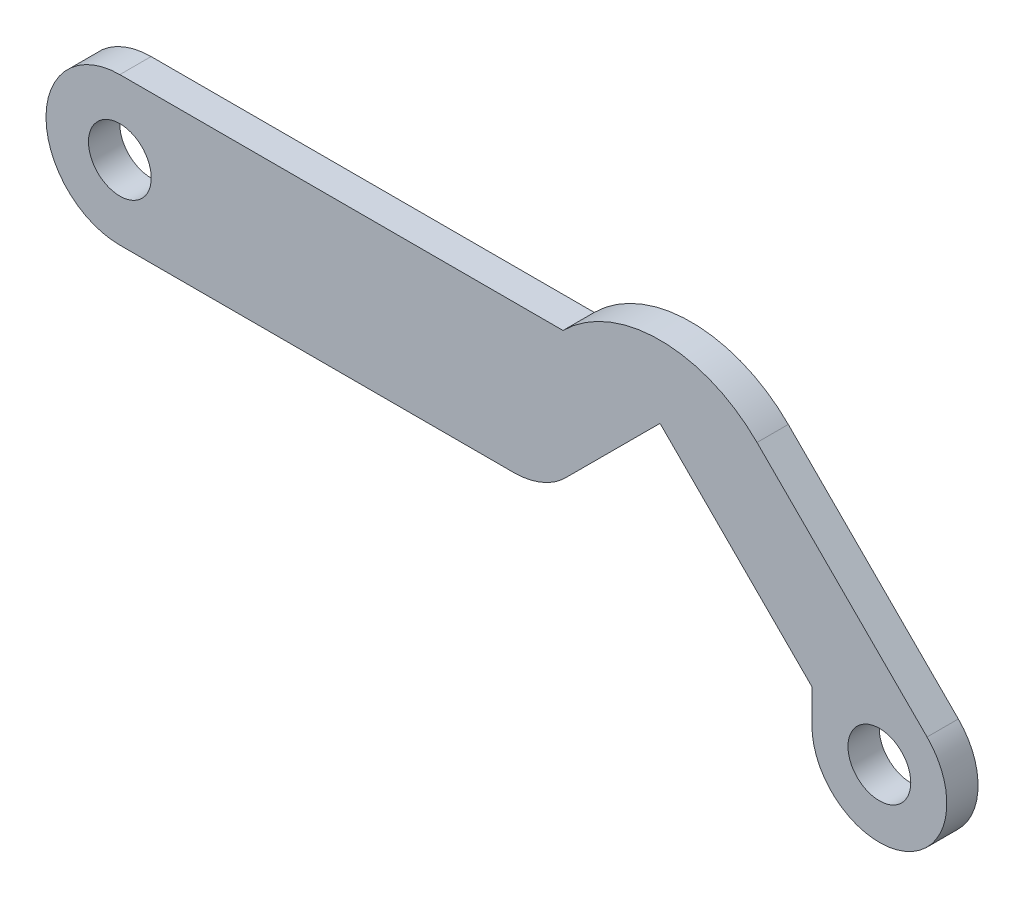
ISO-10303-21;
HEADER;
FILE_DESCRIPTION(('STEP AP214'),'2;1');
FILE_NAME('part.step','',(''),(''),'','','');
FILE_SCHEMA(('AUTOMOTIVE_DESIGN { 1 0 10303 214 1 1 1 1 }'));
ENDSEC;
DATA;
#1=APPLICATION_CONTEXT('core data for automotive mechanical design processes');
#2=APPLICATION_PROTOCOL_DEFINITION('international standard','automotive_design',2000,#1);
#3=PRODUCT_CONTEXT('',#1,'mechanical');
#4=PRODUCT('Part','Part','',(#3));
#5=PRODUCT_RELATED_PRODUCT_CATEGORY('part','',(#4));
#6=PRODUCT_DEFINITION_FORMATION('','',#4);
#7=PRODUCT_DEFINITION_CONTEXT('part definition',#1,'design');
#8=PRODUCT_DEFINITION('design','',#6,#7);
#9=PRODUCT_DEFINITION_SHAPE('','',#8);
#10=(LENGTH_UNIT() NAMED_UNIT(*) SI_UNIT(.MILLI.,.METRE.));
#11=(NAMED_UNIT(*) PLANE_ANGLE_UNIT() SI_UNIT($,.RADIAN.));
#12=(NAMED_UNIT(*) SI_UNIT($,.STERADIAN.) SOLID_ANGLE_UNIT());
#13=UNCERTAINTY_MEASURE_WITH_UNIT(LENGTH_MEASURE(1.E-05),#10,'distance_accuracy_value','');
#14=(GEOMETRIC_REPRESENTATION_CONTEXT(3) GLOBAL_UNCERTAINTY_ASSIGNED_CONTEXT((#13)) GLOBAL_UNIT_ASSIGNED_CONTEXT((#10,
#11,#12)) REPRESENTATION_CONTEXT('',''));
#15=CARTESIAN_POINT('',(0.,0.,0.));
#16=DIRECTION('',(0.,0.,1.));
#17=DIRECTION('',(1.,0.,0.));
#18=AXIS2_PLACEMENT_3D('',#15,#16,#17);
#19=CARTESIAN_POINT('',(0.,0.,3.175));
#20=DIRECTION('',(0.,0.,1.));
#21=DIRECTION('',(1.,0.,0.));
#22=AXIS2_PLACEMENT_3D('',#19,#20,#21);
#23=PLANE('',#22);
#24=DIRECTION('',(0.707106781186546,-0.707106781186549,0.));
#25=VECTOR('',#24,1.);
#26=CARTESIAN_POINT('',(17.3544964901299,17.3544964901299,3.175));
#27=LINE('',#26,#25);
#28=CARTESIAN_POINT('',(27.2089929802598,7.5,3.175));
#29=VERTEX_POINT('',#28);
#30=CARTESIAN_POINT('',(44.4795253726149,-9.77053239235524,3.175));
#31=VERTEX_POINT('',#30);
#32=EDGE_CURVE('E282',#29,#31,#27,.T.);
#33=ORIENTED_EDGE('',*,*,#32,.F.);
#34=CARTESIAN_POINT('',(17.3584345872163,-2.35055839304351,3.175));
#35=DIRECTION('',(0.,0.,1.));
#36=DIRECTION('',(1.,0.,0.));
#37=AXIS2_PLACEMENT_3D('',#34,#35,#36);
#38=CIRCLE('',#37,13.9307932763902);
#39=CARTESIAN_POINT('',(7.5078761941729,7.5,3.175));
#40=VERTEX_POINT('',#39);
#41=EDGE_CURVE('E223',#40,#29,#38,.F.);
#42=ORIENTED_EDGE('',*,*,#41,.F.);
#43=DIRECTION('',(1.,0.,0.));
#44=VECTOR('',#43,1.);
#45=CARTESIAN_POINT('',(-20.71,7.5,3.175));
#46=LINE('',#45,#44);
#47=CARTESIAN_POINT('',(-37.5,7.5,3.175));
#48=VERTEX_POINT('',#47);
#49=EDGE_CURVE('E216',#48,#40,#46,.T.);
#50=ORIENTED_EDGE('',*,*,#49,.F.);
#51=CARTESIAN_POINT('',(-37.5,0.,3.175));
#52=DIRECTION('',(0.,0.,1.));
#53=DIRECTION('',(1.,0.,0.));
#54=AXIS2_PLACEMENT_3D('',#51,#52,#53);
#55=CIRCLE('',#54,7.5);
#56=CARTESIAN_POINT('',(-37.5,-7.5,3.175));
#57=VERTEX_POINT('',#56);
#58=EDGE_CURVE('E220',#57,#48,#55,.F.);
#59=ORIENTED_EDGE('',*,*,#58,.F.);
#60=DIRECTION('',(1.,0.,0.));
#61=VECTOR('',#60,1.);
#62=CARTESIAN_POINT('',(0.,-7.5,3.175));
#63=LINE('',#62,#61);
#64=CARTESIAN_POINT('',(2.5,-7.5,3.175));
#65=VERTEX_POINT('',#64);
#66=EDGE_CURVE('E12',#57,#65,#63,.T.);
#67=ORIENTED_EDGE('',*,*,#66,.T.);
#68=CARTESIAN_POINT('',(2.5,0.,3.175));
#69=DIRECTION('',(0.,0.,1.));
#70=DIRECTION('',(1.,0.,0.));
#71=AXIS2_PLACEMENT_3D('',#68,#69,#70);
#72=CIRCLE('',#71,7.5);
#73=CARTESIAN_POINT('',(8.03869510450984,-5.05696119614128,3.175));
#74=VERTEX_POINT('',#73);
#75=EDGE_CURVE('E302',#65,#74,#72,.T.);
#76=ORIENTED_EDGE('',*,*,#75,.T.);
#77=DIRECTION('',(0.707457856158301,0.706755531821223,0.));
#78=VECTOR('',#77,1.);
#79=CARTESIAN_POINT('',(6.54383474051305,-6.55033754691378,3.175));
#80=LINE('',#79,#78);
#81=CARTESIAN_POINT('',(17.3584345872163,4.25352617381113,3.175));
#82=VERTEX_POINT('',#81);
#83=EDGE_CURVE('E272',#74,#82,#80,.T.);
#84=ORIENTED_EDGE('',*,*,#83,.T.);
#85=DIRECTION('',(-0.706755531821223,0.707457856158301,0.));
#86=VECTOR('',#85,1.);
#87=CARTESIAN_POINT('',(32.7858439214871,-11.1892138434832,3.175));
#88=LINE('',#87,#86);
#89=CARTESIAN_POINT('',(32.7858439214871,-11.1892138434832,3.175));
#90=VERTEX_POINT('',#89);
#91=EDGE_CURVE('E162',#90,#82,#88,.T.);
#92=ORIENTED_EDGE('',*,*,#91,.F.);
#93=DIRECTION('',(0.,1.,0.));
#94=VECTOR('',#93,1.);
#95=CARTESIAN_POINT('',(32.7858439214871,-14.6142138434831,3.175));
#96=LINE('',#95,#94);
#97=CARTESIAN_POINT('',(32.7858439214871,-14.6142138434831,3.175));
#98=VERTEX_POINT('',#97);
#99=EDGE_CURVE('E284',#98,#90,#96,.T.);
#100=ORIENTED_EDGE('',*,*,#99,.F.);
#101=CARTESIAN_POINT('',(39.6358439214871,-14.6142138434831,3.175));
#102=DIRECTION('',(0.,0.,1.));
#103=DIRECTION('',(1.,0.,0.));
#104=AXIS2_PLACEMENT_3D('',#101,#102,#103);
#105=CIRCLE('',#104,6.85);
#106=EDGE_CURVE('E292',#31,#98,#105,.F.);
#107=ORIENTED_EDGE('',*,*,#106,.F.);
#108=EDGE_LOOP('',(#33,#42,#50,#59,#67,#76,#84,#92,#100,#107));
#109=FACE_BOUND('',#108,.T.);
#110=CARTESIAN_POINT('',(39.6358439214871,-14.6142138434831,3.175));
#111=DIRECTION('',(0.,0.,1.));
#112=DIRECTION('',(1.,0.,0.));
#113=AXIS2_PLACEMENT_3D('',#110,#111,#112);
#114=CIRCLE('',#113,3.1875);
#115=CARTESIAN_POINT('',(42.8233439214871,-14.6142138434831,3.175));
#116=VERTEX_POINT('',#115);
#117=EDGE_CURVE('E248',#116,#116,#114,.F.);
#118=ORIENTED_EDGE('',*,*,#117,.T.);
#119=EDGE_LOOP('',(#118));
#120=FACE_BOUND('',#119,.T.);
#121=CARTESIAN_POINT('',(-37.5,0.,3.175));
#122=DIRECTION('',(0.,0.,1.));
#123=DIRECTION('',(1.,0.,0.));
#124=AXIS2_PLACEMENT_3D('',#121,#122,#123);
#125=CIRCLE('',#124,3.1875);
#126=CARTESIAN_POINT('',(-34.3125,0.,3.175));
#127=VERTEX_POINT('',#126);
#128=EDGE_CURVE('E241',#127,#127,#125,.F.);
#129=ORIENTED_EDGE('',*,*,#128,.T.);
#130=EDGE_LOOP('',(#129));
#131=FACE_BOUND('',#130,.T.);
#132=ADVANCED_FACE('F139',(#109,#120,#131),#23,.T.);
#133=CARTESIAN_POINT('',(0.,0.,0.));
#134=DIRECTION('',(0.,0.,1.));
#135=DIRECTION('',(1.,0.,0.));
#136=AXIS2_PLACEMENT_3D('',#133,#134,#135);
#137=PLANE('',#136);
#138=DIRECTION('',(1.,0.,0.));
#139=VECTOR('',#138,1.);
#140=CARTESIAN_POINT('',(-20.71,7.5,0.));
#141=LINE('',#140,#139);
#142=CARTESIAN_POINT('',(-37.5,7.5,0.));
#143=VERTEX_POINT('',#142);
#144=CARTESIAN_POINT('',(7.50787619417291,7.5,0.));
#145=VERTEX_POINT('',#144);
#146=EDGE_CURVE('E226',#143,#145,#141,.T.);
#147=ORIENTED_EDGE('',*,*,#146,.T.);
#148=CARTESIAN_POINT('',(17.3584345872163,-2.35055839304351,0.));
#149=DIRECTION('',(0.,0.,-1.));
#150=DIRECTION('',(1.,0.,0.));
#151=AXIS2_PLACEMENT_3D('',#148,#149,#150);
#152=CIRCLE('',#151,13.9307932763902);
#153=CARTESIAN_POINT('',(27.2089929802598,7.5,0.));
#154=VERTEX_POINT('',#153);
#155=EDGE_CURVE('E251',#145,#154,#152,.T.);
#156=ORIENTED_EDGE('',*,*,#155,.T.);
#157=DIRECTION('',(-0.707106781186546,0.707106781186549,0.));
#158=VECTOR('',#157,1.);
#159=CARTESIAN_POINT('',(17.3544964901299,17.3544964901299,0.));
#160=LINE('',#159,#158);
#161=CARTESIAN_POINT('',(44.4795253726149,-9.77053239235524,0.));
#162=VERTEX_POINT('',#161);
#163=EDGE_CURVE('E275',#162,#154,#160,.T.);
#164=ORIENTED_EDGE('',*,*,#163,.F.);
#165=CARTESIAN_POINT('',(39.6358439214871,-14.6142138434831,0.));
#166=DIRECTION('',(0.,0.,-1.));
#167=DIRECTION('',(-1.,0.,0.));
#168=AXIS2_PLACEMENT_3D('',#165,#166,#167);
#169=CIRCLE('',#168,6.85);
#170=CARTESIAN_POINT('',(32.7858439214871,-14.6142138434831,0.));
#171=VERTEX_POINT('',#170);
#172=EDGE_CURVE('E293',#162,#171,#169,.T.);
#173=ORIENTED_EDGE('',*,*,#172,.T.);
#174=DIRECTION('',(0.,1.,0.));
#175=VECTOR('',#174,1.);
#176=CARTESIAN_POINT('',(32.7858439214871,-14.6142138434831,0.));
#177=LINE('',#176,#175);
#178=CARTESIAN_POINT('',(32.7858439214871,-11.1892138434832,0.));
#179=VERTEX_POINT('',#178);
#180=EDGE_CURVE('E287',#171,#179,#177,.T.);
#181=ORIENTED_EDGE('',*,*,#180,.T.);
#182=DIRECTION('',(-0.706755531821223,0.707457856158301,0.));
#183=VECTOR('',#182,1.);
#184=CARTESIAN_POINT('',(32.7858439214871,-11.1892138434832,0.));
#185=LINE('',#184,#183);
#186=CARTESIAN_POINT('',(17.3584345872163,4.25352617381113,0.));
#187=VERTEX_POINT('',#186);
#188=EDGE_CURVE('E259',#179,#187,#185,.T.);
#189=ORIENTED_EDGE('',*,*,#188,.T.);
#190=DIRECTION('',(0.707457856158301,0.706755531821223,0.));
#191=VECTOR('',#190,1.);
#192=CARTESIAN_POINT('',(6.54383474051305,-6.55033754691378,0.));
#193=LINE('',#192,#191);
#194=CARTESIAN_POINT('',(8.03869510450984,-5.05696119614128,0.));
#195=VERTEX_POINT('',#194);
#196=EDGE_CURVE('E269',#195,#187,#193,.T.);
#197=ORIENTED_EDGE('',*,*,#196,.F.);
#198=CARTESIAN_POINT('',(2.5,0.,0.));
#199=DIRECTION('',(0.,0.,-1.));
#200=DIRECTION('',(-1.,0.,0.));
#201=AXIS2_PLACEMENT_3D('',#198,#199,#200);
#202=CIRCLE('',#201,7.5);
#203=CARTESIAN_POINT('',(2.5,-7.5,0.));
#204=VERTEX_POINT('',#203);
#205=EDGE_CURVE('E296',#195,#204,#202,.T.);
#206=ORIENTED_EDGE('',*,*,#205,.T.);
#207=DIRECTION('',(1.,0.,0.));
#208=VECTOR('',#207,1.);
#209=CARTESIAN_POINT('',(0.,-7.5,0.));
#210=LINE('',#209,#208);
#211=CARTESIAN_POINT('',(-37.5,-7.5,0.));
#212=VERTEX_POINT('',#211);
#213=EDGE_CURVE('E143',#212,#204,#210,.T.);
#214=ORIENTED_EDGE('',*,*,#213,.F.);
#215=CARTESIAN_POINT('',(-37.5,0.,0.));
#216=DIRECTION('',(0.,0.,-1.));
#217=DIRECTION('',(-1.,0.,0.));
#218=AXIS2_PLACEMENT_3D('',#215,#216,#217);
#219=CIRCLE('',#218,7.5);
#220=EDGE_CURVE('E239',#212,#143,#219,.T.);
#221=ORIENTED_EDGE('',*,*,#220,.T.);
#222=EDGE_LOOP('',(#147,#156,#164,#173,#181,#189,#197,#206,#214,#221));
#223=FACE_BOUND('',#222,.T.);
#224=CARTESIAN_POINT('',(39.6358439214871,-14.6142138434831,0.));
#225=DIRECTION('',(0.,0.,-1.));
#226=DIRECTION('',(-1.,0.,0.));
#227=AXIS2_PLACEMENT_3D('',#224,#225,#226);
#228=CIRCLE('',#227,3.1875);
#229=CARTESIAN_POINT('',(36.4483439214871,-14.6142138434831,0.));
#230=VERTEX_POINT('',#229);
#231=EDGE_CURVE('E245',#230,#230,#228,.T.);
#232=ORIENTED_EDGE('',*,*,#231,.F.);
#233=EDGE_LOOP('',(#232));
#234=FACE_BOUND('',#233,.T.);
#235=CARTESIAN_POINT('',(-37.5,0.,0.));
#236=DIRECTION('',(0.,0.,-1.));
#237=DIRECTION('',(-1.,0.,0.));
#238=AXIS2_PLACEMENT_3D('',#235,#236,#237);
#239=CIRCLE('',#238,3.1875);
#240=CARTESIAN_POINT('',(-40.6875,0.,0.));
#241=VERTEX_POINT('',#240);
#242=EDGE_CURVE('E236',#241,#241,#239,.T.);
#243=ORIENTED_EDGE('',*,*,#242,.F.);
#244=EDGE_LOOP('',(#243));
#245=FACE_BOUND('',#244,.T.);
#246=ADVANCED_FACE('F309',(#223,#234,#245),#137,.F.);
#247=CARTESIAN_POINT('',(17.3544964901299,17.3544964901299,10.));
#248=DIRECTION('',(-0.707106781186549,-0.707106781186546,0.));
#249=DIRECTION('',(0.707106781186546,-0.707106781186549,0.));
#250=AXIS2_PLACEMENT_3D('',#247,#248,#249);
#251=PLANE('',#250);
#252=DIRECTION('',(0.,0.,-1.));
#253=VECTOR('',#252,1.);
#254=CARTESIAN_POINT('',(27.2089929802598,7.5,10.));
#255=LINE('',#254,#253);
#256=EDGE_CURVE('E225',#29,#154,#255,.T.);
#257=ORIENTED_EDGE('',*,*,#256,.F.);
#258=ORIENTED_EDGE('',*,*,#32,.T.);
#259=DIRECTION('',(0.,0.,-1.));
#260=VECTOR('',#259,1.);
#261=CARTESIAN_POINT('',(44.4795253726149,-9.77053239235524,10.));
#262=LINE('',#261,#260);
#263=EDGE_CURVE('E279',#31,#162,#262,.T.);
#264=ORIENTED_EDGE('',*,*,#263,.T.);
#265=ORIENTED_EDGE('',*,*,#163,.T.);
#266=EDGE_LOOP('',(#257,#258,#264,#265));
#267=FACE_BOUND('',#266,.T.);
#268=ADVANCED_FACE('F329',(#267),#251,.F.);
#269=CARTESIAN_POINT('',(2.5,0.,10.));
#270=DIRECTION('',(0.,0.,-1.));
#271=DIRECTION('',(-1.,0.,0.));
#272=AXIS2_PLACEMENT_3D('',#269,#270,#271);
#273=CYLINDRICAL_SURFACE('',#272,7.5);
#274=ORIENTED_EDGE('',*,*,#205,.F.);
#275=DIRECTION('',(0.,0.,-1.));
#276=VECTOR('',#275,1.);
#277=CARTESIAN_POINT('',(8.03869510450984,-5.05696119614128,22.7930069860334));
#278=LINE('',#277,#276);
#279=EDGE_CURVE('E266',#74,#195,#278,.T.);
#280=ORIENTED_EDGE('',*,*,#279,.F.);
#281=ORIENTED_EDGE('',*,*,#75,.F.);
#282=DIRECTION('',(0.,0.,-1.));
#283=VECTOR('',#282,1.);
#284=CARTESIAN_POINT('',(2.5,-7.5,10.));
#285=LINE('',#284,#283);
#286=EDGE_CURVE('E299',#65,#204,#285,.T.);
#287=ORIENTED_EDGE('',*,*,#286,.T.);
#288=EDGE_LOOP('',(#274,#280,#281,#287));
#289=FACE_BOUND('',#288,.T.);
#290=ADVANCED_FACE('F313',(#289),#273,.T.);
#291=CARTESIAN_POINT('',(39.6358439214871,-14.6142138434831,66.0414426696379));
#292=DIRECTION('',(0.,0.,-1.));
#293=DIRECTION('',(-1.,0.,0.));
#294=AXIS2_PLACEMENT_3D('',#291,#292,#293);
#295=CYLINDRICAL_SURFACE('',#294,6.85);
#296=DIRECTION('',(0.,0.,-1.));
#297=VECTOR('',#296,1.);
#298=CARTESIAN_POINT('',(32.7858439214871,-14.6142138434831,48.6079332700379));
#299=LINE('',#298,#297);
#300=EDGE_CURVE('E285',#98,#171,#299,.T.);
#301=ORIENTED_EDGE('',*,*,#300,.T.);
#302=ORIENTED_EDGE('',*,*,#172,.F.);
#303=ORIENTED_EDGE('',*,*,#263,.F.);
#304=ORIENTED_EDGE('',*,*,#106,.T.);
#305=EDGE_LOOP('',(#301,#302,#303,#304));
#306=FACE_BOUND('',#305,.T.);
#307=ADVANCED_FACE('F324',(#306),#295,.T.);
#308=CARTESIAN_POINT('',(0.,-7.5,3.175));
#309=DIRECTION('',(0.,1.,0.));
#310=DIRECTION('',(0.,0.,1.));
#311=AXIS2_PLACEMENT_3D('',#308,#309,#310);
#312=PLANE('',#311);
#313=ORIENTED_EDGE('',*,*,#286,.F.);
#314=ORIENTED_EDGE('',*,*,#66,.F.);
#315=DIRECTION('',(0.,0.,-1.));
#316=VECTOR('',#315,1.);
#317=CARTESIAN_POINT('',(-37.5,-7.5,31.7232766555181));
#318=LINE('',#317,#316);
#319=EDGE_CURVE('E235',#57,#212,#318,.T.);
#320=ORIENTED_EDGE('',*,*,#319,.T.);
#321=ORIENTED_EDGE('',*,*,#213,.T.);
#322=EDGE_LOOP('',(#313,#314,#320,#321));
#323=FACE_BOUND('',#322,.T.);
#324=ADVANCED_FACE('F141',(#323),#312,.F.);
#325=CARTESIAN_POINT('',(32.7858439214871,-14.6142138434831,48.6079332700379));
#326=DIRECTION('',(-1.,0.,0.));
#327=DIRECTION('',(0.,0.,1.));
#328=AXIS2_PLACEMENT_3D('',#325,#326,#327);
#329=PLANE('',#328);
#330=DIRECTION('',(0.,0.,-1.));
#331=VECTOR('',#330,1.);
#332=CARTESIAN_POINT('',(32.7858439214871,-11.1892138434832,26.2404555706567));
#333=LINE('',#332,#331);
#334=EDGE_CURVE('E262',#90,#179,#333,.T.);
#335=ORIENTED_EDGE('',*,*,#334,.T.);
#336=ORIENTED_EDGE('',*,*,#180,.F.);
#337=ORIENTED_EDGE('',*,*,#300,.F.);
#338=ORIENTED_EDGE('',*,*,#99,.T.);
#339=EDGE_LOOP('',(#335,#336,#337,#338));
#340=FACE_BOUND('',#339,.T.);
#341=ADVANCED_FACE('F322',(#340),#329,.T.);
#342=CARTESIAN_POINT('',(6.54383474051305,-6.55033754691378,22.7930069860334));
#343=DIRECTION('',(-0.706755531821223,0.707457856158301,0.));
#344=DIRECTION('',(-0.707457856158301,-0.706755531821223,0.));
#345=AXIS2_PLACEMENT_3D('',#342,#343,#344);
#346=PLANE('',#345);
#347=ORIENTED_EDGE('',*,*,#196,.T.);
#348=DIRECTION('',(0.,0.,-1.));
#349=VECTOR('',#348,1.);
#350=CARTESIAN_POINT('',(17.3584345872163,4.25352617381113,26.2404555706567));
#351=LINE('',#350,#349);
#352=EDGE_CURVE('E264',#82,#187,#351,.T.);
#353=ORIENTED_EDGE('',*,*,#352,.F.);
#354=ORIENTED_EDGE('',*,*,#83,.F.);
#355=ORIENTED_EDGE('',*,*,#279,.T.);
#356=EDGE_LOOP('',(#347,#353,#354,#355));
#357=FACE_BOUND('',#356,.T.);
#358=ADVANCED_FACE('F315',(#357),#346,.F.);
#359=CARTESIAN_POINT('',(32.7858439214871,-11.1892138434832,26.2404555706567));
#360=DIRECTION('',(-0.707457856158301,-0.706755531821223,0.));
#361=DIRECTION('',(0.706755531821223,-0.707457856158301,0.));
#362=AXIS2_PLACEMENT_3D('',#359,#360,#361);
#363=PLANE('',#362);
#364=ORIENTED_EDGE('',*,*,#334,.F.);
#365=ORIENTED_EDGE('',*,*,#91,.T.);
#366=ORIENTED_EDGE('',*,*,#352,.T.);
#367=ORIENTED_EDGE('',*,*,#188,.F.);
#368=EDGE_LOOP('',(#364,#365,#366,#367));
#369=FACE_BOUND('',#368,.T.);
#370=ADVANCED_FACE('F319',(#369),#363,.T.);
#371=CARTESIAN_POINT('',(-20.71,7.5,54.5776623562401));
#372=DIRECTION('',(0.,1.,0.));
#373=DIRECTION('',(0.,0.,1.));
#374=AXIS2_PLACEMENT_3D('',#371,#372,#373);
#375=PLANE('',#374);
#376=DIRECTION('',(0.,0.,-1.));
#377=VECTOR('',#376,1.);
#378=CARTESIAN_POINT('',(7.5078761941729,7.5,23.2942027506637));
#379=LINE('',#378,#377);
#380=EDGE_CURVE('E154',#40,#145,#379,.T.);
#381=ORIENTED_EDGE('',*,*,#380,.T.);
#382=ORIENTED_EDGE('',*,*,#146,.F.);
#383=DIRECTION('',(0.,0.,-1.));
#384=VECTOR('',#383,1.);
#385=CARTESIAN_POINT('',(-37.5,7.5,31.7232766555181));
#386=LINE('',#385,#384);
#387=EDGE_CURVE('E232',#48,#143,#386,.T.);
#388=ORIENTED_EDGE('',*,*,#387,.F.);
#389=ORIENTED_EDGE('',*,*,#49,.T.);
#390=EDGE_LOOP('',(#381,#382,#388,#389));
#391=FACE_BOUND('',#390,.T.);
#392=ADVANCED_FACE('F238',(#391),#375,.T.);
#393=CARTESIAN_POINT('',(17.3584345872163,-2.35055839304351,23.2942027506637));
#394=DIRECTION('',(0.,0.,-1.));
#395=DIRECTION('',(-1.,0.,0.));
#396=AXIS2_PLACEMENT_3D('',#393,#394,#395);
#397=CYLINDRICAL_SURFACE('',#396,13.9307932763902);
#398=ORIENTED_EDGE('',*,*,#380,.F.);
#399=ORIENTED_EDGE('',*,*,#41,.T.);
#400=ORIENTED_EDGE('',*,*,#256,.T.);
#401=ORIENTED_EDGE('',*,*,#155,.F.);
#402=EDGE_LOOP('',(#398,#399,#400,#401));
#403=FACE_BOUND('',#402,.T.);
#404=ADVANCED_FACE('F331',(#403),#397,.T.);
#405=CARTESIAN_POINT('',(39.6358439214871,-14.6142138434831,22.1711669907536));
#406=DIRECTION('',(0.,0.,-1.));
#407=DIRECTION('',(-1.,0.,0.));
#408=AXIS2_PLACEMENT_3D('',#405,#406,#407);
#409=CYLINDRICAL_SURFACE('',#408,3.1875);
#410=ORIENTED_EDGE('',*,*,#231,.T.);
#411=EDGE_LOOP('',(#410));
#412=FACE_BOUND('',#411,.T.);
#413=ORIENTED_EDGE('',*,*,#117,.F.);
#414=EDGE_LOOP('',(#413));
#415=FACE_BOUND('',#414,.T.);
#416=ADVANCED_FACE('F333',(#412,#415),#409,.F.);
#417=CARTESIAN_POINT('',(-37.5,0.,31.7232766555181));
#418=DIRECTION('',(0.,0.,-1.));
#419=DIRECTION('',(-1.,0.,0.));
#420=AXIS2_PLACEMENT_3D('',#417,#418,#419);
#421=CYLINDRICAL_SURFACE('',#420,3.1875);
#422=ORIENTED_EDGE('',*,*,#242,.T.);
#423=EDGE_LOOP('',(#422));
#424=FACE_BOUND('',#423,.T.);
#425=ORIENTED_EDGE('',*,*,#128,.F.);
#426=EDGE_LOOP('',(#425));
#427=FACE_BOUND('',#426,.T.);
#428=ADVANCED_FACE('F339',(#424,#427),#421,.F.);
#429=CARTESIAN_POINT('',(-37.5,0.,31.7232766555181));
#430=DIRECTION('',(0.,0.,-1.));
#431=DIRECTION('',(-1.,0.,0.));
#432=AXIS2_PLACEMENT_3D('',#429,#430,#431);
#433=CYLINDRICAL_SURFACE('',#432,7.5);
#434=ORIENTED_EDGE('',*,*,#319,.F.);
#435=ORIENTED_EDGE('',*,*,#58,.T.);
#436=ORIENTED_EDGE('',*,*,#387,.T.);
#437=ORIENTED_EDGE('',*,*,#220,.F.);
#438=EDGE_LOOP('',(#434,#435,#436,#437));
#439=FACE_BOUND('',#438,.T.);
#440=ADVANCED_FACE('F230',(#439),#433,.T.);
#441=CLOSED_SHELL('',(#132,#246,#268,#290,#307,#324,#341,#358,#370,#392,#404,#416,#428,#440));
#442=MANIFOLD_SOLID_BREP('B2',#441);
#443=ADVANCED_BREP_SHAPE_REPRESENTATION('',(#18,#442),#14);
#444=SHAPE_DEFINITION_REPRESENTATION(#9,#443);
ENDSEC;
END-ISO-10303-21;
